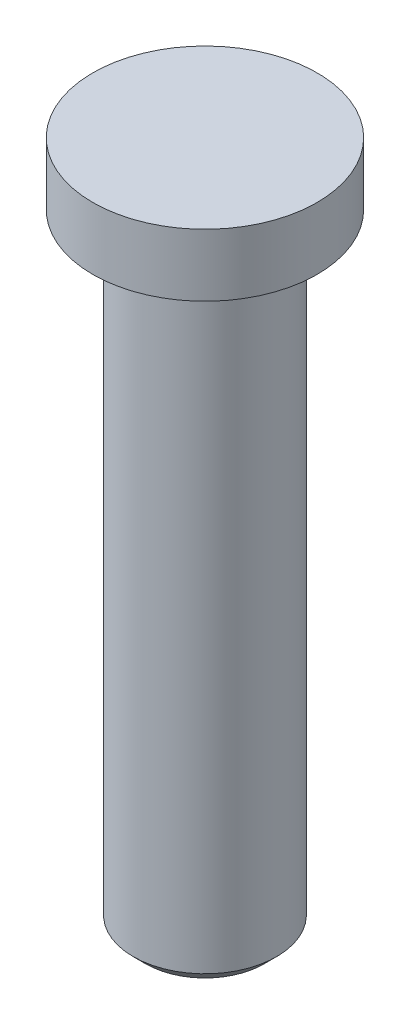
ISO-10303-21;
HEADER;
FILE_DESCRIPTION(('STEP AP214'),'2;1');
FILE_NAME('part.step','',(''),(''),'','','');
FILE_SCHEMA(('AUTOMOTIVE_DESIGN { 1 0 10303 214 1 1 1 1 }'));
ENDSEC;
DATA;
#1=APPLICATION_CONTEXT('core data for automotive mechanical design processes');
#2=APPLICATION_PROTOCOL_DEFINITION('international standard','automotive_design',2000,#1);
#3=PRODUCT_CONTEXT('',#1,'mechanical');
#4=PRODUCT('Part','Part','',(#3));
#5=PRODUCT_RELATED_PRODUCT_CATEGORY('part','',(#4));
#6=PRODUCT_DEFINITION_FORMATION('','',#4);
#7=PRODUCT_DEFINITION_CONTEXT('part definition',#1,'design');
#8=PRODUCT_DEFINITION('design','',#6,#7);
#9=PRODUCT_DEFINITION_SHAPE('','',#8);
#10=(LENGTH_UNIT() NAMED_UNIT(*) SI_UNIT(.MILLI.,.METRE.));
#11=(NAMED_UNIT(*) PLANE_ANGLE_UNIT() SI_UNIT($,.RADIAN.));
#12=(NAMED_UNIT(*) SI_UNIT($,.STERADIAN.) SOLID_ANGLE_UNIT());
#13=UNCERTAINTY_MEASURE_WITH_UNIT(LENGTH_MEASURE(1.E-05),#10,'distance_accuracy_value','');
#14=(GEOMETRIC_REPRESENTATION_CONTEXT(3) GLOBAL_UNCERTAINTY_ASSIGNED_CONTEXT((#13)) GLOBAL_UNIT_ASSIGNED_CONTEXT((#10,
#11,#12)) REPRESENTATION_CONTEXT('',''));
#15=CARTESIAN_POINT('',(0.,0.,0.));
#16=DIRECTION('',(0.,0.,1.));
#17=DIRECTION('',(1.,0.,0.));
#18=AXIS2_PLACEMENT_3D('',#15,#16,#17);
#19=CARTESIAN_POINT('',(0.,5.,0.));
#20=DIRECTION('',(0.,-1.,0.));
#21=DIRECTION('',(0.,0.,-1.));
#22=AXIS2_PLACEMENT_3D('',#19,#20,#21);
#23=CYLINDRICAL_SURFACE('',#22,0.575);
#24=CARTESIAN_POINT('',(0.,0.1,0.));
#25=DIRECTION('',(0.,1.,0.));
#26=DIRECTION('',(0.,0.,1.));
#27=AXIS2_PLACEMENT_3D('',#24,#25,#26);
#28=CIRCLE('',#27,0.575);
#29=CARTESIAN_POINT('',(0.,0.1,0.575));
#30=VERTEX_POINT('',#29);
#31=EDGE_CURVE('E50',#30,#30,#28,.T.);
#32=ORIENTED_EDGE('',*,*,#31,.T.);
#33=EDGE_LOOP('',(#32));
#34=FACE_BOUND('',#33,.T.);
#35=CARTESIAN_POINT('',(0.,5.,0.));
#36=DIRECTION('',(0.,1.,0.));
#37=DIRECTION('',(0.,0.,1.));
#38=AXIS2_PLACEMENT_3D('',#35,#36,#37);
#39=CIRCLE('',#38,0.575);
#40=CARTESIAN_POINT('',(0.,5.,0.575));
#41=VERTEX_POINT('',#40);
#42=EDGE_CURVE('E51',#41,#41,#39,.T.);
#43=ORIENTED_EDGE('',*,*,#42,.F.);
#44=EDGE_LOOP('',(#43));
#45=FACE_BOUND('',#44,.T.);
#46=ADVANCED_FACE('F39',(#34,#45),#23,.T.);
#47=CARTESIAN_POINT('',(0.,0.,0.));
#48=DIRECTION('',(0.,1.,0.));
#49=DIRECTION('',(0.,0.,1.));
#50=AXIS2_PLACEMENT_3D('',#47,#48,#49);
#51=PLANE('',#50);
#52=CARTESIAN_POINT('',(0.,0.,0.));
#53=DIRECTION('',(0.,1.,0.));
#54=DIRECTION('',(0.,0.,1.));
#55=AXIS2_PLACEMENT_3D('',#52,#53,#54);
#56=CIRCLE('',#55,0.475);
#57=CARTESIAN_POINT('',(0.,0.,0.475));
#58=VERTEX_POINT('',#57);
#59=EDGE_CURVE('E10',#58,#58,#56,.F.);
#60=ORIENTED_EDGE('',*,*,#59,.T.);
#61=EDGE_LOOP('',(#60));
#62=FACE_BOUND('',#61,.T.);
#63=ADVANCED_FACE('F69',(#62),#51,.F.);
#64=CARTESIAN_POINT('',(0.,5.5,0.));
#65=DIRECTION('',(0.,-1.,0.));
#66=DIRECTION('',(0.,0.,-1.));
#67=AXIS2_PLACEMENT_3D('',#64,#65,#66);
#68=CYLINDRICAL_SURFACE('',#67,0.9);
#69=CARTESIAN_POINT('',(0.,5.5,0.));
#70=DIRECTION('',(0.,1.,0.));
#71=DIRECTION('',(0.,0.,1.));
#72=AXIS2_PLACEMENT_3D('',#69,#70,#71);
#73=CIRCLE('',#72,0.9);
#74=CARTESIAN_POINT('',(0.,5.5,0.9));
#75=VERTEX_POINT('',#74);
#76=EDGE_CURVE('E54',#75,#75,#73,.T.);
#77=ORIENTED_EDGE('',*,*,#76,.F.);
#78=EDGE_LOOP('',(#77));
#79=FACE_BOUND('',#78,.T.);
#80=CARTESIAN_POINT('',(0.,5.,0.));
#81=DIRECTION('',(0.,1.,0.));
#82=DIRECTION('',(0.,0.,1.));
#83=AXIS2_PLACEMENT_3D('',#80,#81,#82);
#84=CIRCLE('',#83,0.9);
#85=CARTESIAN_POINT('',(0.,5.,0.9));
#86=VERTEX_POINT('',#85);
#87=EDGE_CURVE('E59',#86,#86,#84,.T.);
#88=ORIENTED_EDGE('',*,*,#87,.T.);
#89=EDGE_LOOP('',(#88));
#90=FACE_BOUND('',#89,.T.);
#91=ADVANCED_FACE('F68',(#79,#90),#68,.T.);
#92=CARTESIAN_POINT('',(0.,5.5,0.));
#93=DIRECTION('',(0.,1.,0.));
#94=DIRECTION('',(0.,0.,1.));
#95=AXIS2_PLACEMENT_3D('',#92,#93,#94);
#96=PLANE('',#95);
#97=ORIENTED_EDGE('',*,*,#76,.T.);
#98=EDGE_LOOP('',(#97));
#99=FACE_BOUND('',#98,.T.);
#100=ADVANCED_FACE('F63',(#99),#96,.T.);
#101=CARTESIAN_POINT('',(0.,5.,0.));
#102=DIRECTION('',(0.,1.,0.));
#103=DIRECTION('',(0.,0.,1.));
#104=AXIS2_PLACEMENT_3D('',#101,#102,#103);
#105=PLANE('',#104);
#106=ORIENTED_EDGE('',*,*,#42,.T.);
#107=EDGE_LOOP('',(#106));
#108=FACE_BOUND('',#107,.T.);
#109=ORIENTED_EDGE('',*,*,#87,.F.);
#110=EDGE_LOOP('',(#109));
#111=FACE_BOUND('',#110,.T.);
#112=ADVANCED_FACE('F71',(#108,#111),#105,.F.);
#113=CARTESIAN_POINT('',(0.,0.1,0.));
#114=DIRECTION('',(0.,1.,0.));
#115=DIRECTION('',(0.,0.,1.));
#116=AXIS2_PLACEMENT_3D('',#113,#114,#115);
#117=CONICAL_SURFACE('',#116,0.575,0.785398163397448);
#118=ORIENTED_EDGE('',*,*,#59,.F.);
#119=EDGE_LOOP('',(#118));
#120=FACE_BOUND('',#119,.T.);
#121=ORIENTED_EDGE('',*,*,#31,.F.);
#122=EDGE_LOOP('',(#121));
#123=FACE_BOUND('',#122,.T.);
#124=ADVANCED_FACE('F45',(#120,#123),#117,.T.);
#125=CLOSED_SHELL('',(#46,#63,#91,#100,#112,#124));
#126=MANIFOLD_SOLID_BREP('B2',#125);
#127=ADVANCED_BREP_SHAPE_REPRESENTATION('',(#18,#126),#14);
#128=SHAPE_DEFINITION_REPRESENTATION(#9,#127);
ENDSEC;
END-ISO-10303-21;
